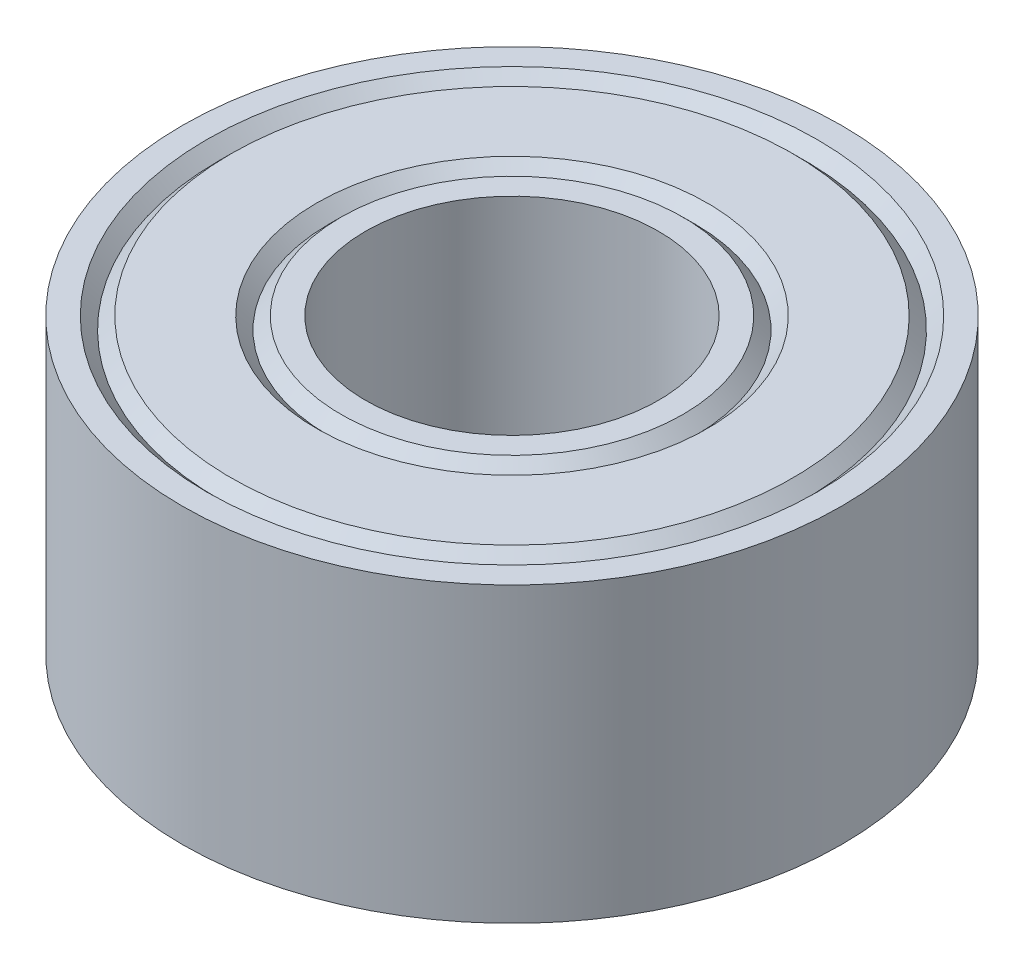
ISO-10303-21;
HEADER;
FILE_DESCRIPTION(('STEP AP214'),'2;1');
FILE_NAME('part.step','',(''),(''),'','','');
FILE_SCHEMA(('AUTOMOTIVE_DESIGN { 1 0 10303 214 1 1 1 1 }'));
ENDSEC;
DATA;
#1=APPLICATION_CONTEXT('core data for automotive mechanical design processes');
#2=APPLICATION_PROTOCOL_DEFINITION('international standard','automotive_design',2000,#1);
#3=PRODUCT_CONTEXT('',#1,'mechanical');
#4=PRODUCT('Part','Part','',(#3));
#5=PRODUCT_RELATED_PRODUCT_CATEGORY('part','',(#4));
#6=PRODUCT_DEFINITION_FORMATION('','',#4);
#7=PRODUCT_DEFINITION_CONTEXT('part definition',#1,'design');
#8=PRODUCT_DEFINITION('design','',#6,#7);
#9=PRODUCT_DEFINITION_SHAPE('','',#8);
#10=(LENGTH_UNIT() NAMED_UNIT(*) SI_UNIT(.MILLI.,.METRE.));
#11=(NAMED_UNIT(*) PLANE_ANGLE_UNIT() SI_UNIT($,.RADIAN.));
#12=(NAMED_UNIT(*) SI_UNIT($,.STERADIAN.) SOLID_ANGLE_UNIT());
#13=UNCERTAINTY_MEASURE_WITH_UNIT(LENGTH_MEASURE(1.E-05),#10,'distance_accuracy_value','');
#14=(GEOMETRIC_REPRESENTATION_CONTEXT(3) GLOBAL_UNCERTAINTY_ASSIGNED_CONTEXT((#13)) GLOBAL_UNIT_ASSIGNED_CONTEXT((#10,
#11,#12)) REPRESENTATION_CONTEXT('',''));
#15=CARTESIAN_POINT('',(0.,0.,0.));
#16=DIRECTION('',(0.,0.,1.));
#17=DIRECTION('',(1.,0.,0.));
#18=AXIS2_PLACEMENT_3D('',#15,#16,#17);
#19=CARTESIAN_POINT('',(0.,2.,0.));
#20=DIRECTION('',(0.,1.,0.));
#21=DIRECTION('',(-1.,0.,0.));
#22=AXIS2_PLACEMENT_3D('',#19,#20,#21);
#23=CYLINDRICAL_SURFACE('',#22,2.);
#24=CARTESIAN_POINT('',(0.,2.,0.));
#25=DIRECTION('',(0.,1.,0.));
#26=DIRECTION('',(-1.,0.,0.));
#27=AXIS2_PLACEMENT_3D('',#24,#25,#26);
#28=CIRCLE('',#27,1.99999999999999);
#29=CARTESIAN_POINT('',(-1.99999999999999,2.,0.));
#30=VERTEX_POINT('',#29);
#31=EDGE_CURVE('E83',#30,#30,#28,.T.);
#32=ORIENTED_EDGE('',*,*,#31,.T.);
#33=EDGE_LOOP('',(#32));
#34=FACE_BOUND('',#33,.T.);
#35=CARTESIAN_POINT('',(0.,-1.99999999999999,0.));
#36=DIRECTION('',(0.,1.,0.));
#37=DIRECTION('',(-1.,0.,0.));
#38=AXIS2_PLACEMENT_3D('',#35,#36,#37);
#39=CIRCLE('',#38,2.);
#40=CARTESIAN_POINT('',(-1.99999999999999,-2.,0.));
#41=VERTEX_POINT('',#40);
#42=EDGE_CURVE('E10',#41,#41,#39,.T.);
#43=ORIENTED_EDGE('',*,*,#42,.F.);
#44=EDGE_LOOP('',(#43));
#45=FACE_BOUND('',#44,.T.);
#46=ADVANCED_FACE('F31',(#34,#45),#23,.F.);
#47=CARTESIAN_POINT('',(-1.99999999999999,-2.,0.));
#48=DIRECTION('',(0.,-1.,0.));
#49=DIRECTION('',(1.,0.,0.));
#50=AXIS2_PLACEMENT_3D('',#47,#48,#49);
#51=PLANE('',#50);
#52=ORIENTED_EDGE('',*,*,#42,.T.);
#53=EDGE_LOOP('',(#52));
#54=FACE_BOUND('',#53,.T.);
#55=CARTESIAN_POINT('',(0.,-1.99999999999999,0.));
#56=DIRECTION('',(0.,1.,0.));
#57=DIRECTION('',(-1.,0.,0.));
#58=AXIS2_PLACEMENT_3D('',#55,#56,#57);
#59=CIRCLE('',#58,2.33333333333334);
#60=CARTESIAN_POINT('',(-2.33333333333333,-2.,0.));
#61=VERTEX_POINT('',#60);
#62=EDGE_CURVE('E37',#61,#61,#59,.T.);
#63=ORIENTED_EDGE('',*,*,#62,.F.);
#64=EDGE_LOOP('',(#63));
#65=FACE_BOUND('',#64,.T.);
#66=ADVANCED_FACE('F101',(#54,#65),#51,.T.);
#67=CARTESIAN_POINT('',(0.,-1.83333333333332,0.));
#68=DIRECTION('',(0.,1.,0.));
#69=DIRECTION('',(-1.,0.,0.));
#70=AXIS2_PLACEMENT_3D('',#67,#68,#69);
#71=CONICAL_SURFACE('',#70,2.50000000000002,0.785398163397486);
#72=ORIENTED_EDGE('',*,*,#62,.T.);
#73=EDGE_LOOP('',(#72));
#74=FACE_BOUND('',#73,.T.);
#75=CARTESIAN_POINT('',(0.,-1.83333333333332,0.));
#76=DIRECTION('',(0.,1.,0.));
#77=DIRECTION('',(-1.,0.,0.));
#78=AXIS2_PLACEMENT_3D('',#75,#76,#77);
#79=CIRCLE('',#78,2.50000000000002);
#80=CARTESIAN_POINT('',(-2.50000000000001,-1.83333333333333,0.));
#81=VERTEX_POINT('',#80);
#82=EDGE_CURVE('E41',#81,#81,#79,.T.);
#83=ORIENTED_EDGE('',*,*,#82,.F.);
#84=EDGE_LOOP('',(#83));
#85=FACE_BOUND('',#84,.T.);
#86=ADVANCED_FACE('F105',(#74,#85),#71,.T.);
#87=CARTESIAN_POINT('',(0.,-1.99999999999999,0.));
#88=DIRECTION('',(0.,-1.,0.));
#89=DIRECTION('',(1.,0.,0.));
#90=AXIS2_PLACEMENT_3D('',#87,#88,#89);
#91=CONICAL_SURFACE('',#90,2.66666666666669,0.785398163397433);
#92=ORIENTED_EDGE('',*,*,#82,.T.);
#93=EDGE_LOOP('',(#92));
#94=FACE_BOUND('',#93,.T.);
#95=CARTESIAN_POINT('',(0.,-1.99999999999999,0.));
#96=DIRECTION('',(0.,1.,0.));
#97=DIRECTION('',(-1.,0.,0.));
#98=AXIS2_PLACEMENT_3D('',#95,#96,#97);
#99=CIRCLE('',#98,2.66666666666669);
#100=CARTESIAN_POINT('',(-2.66666666666667,-2.,0.));
#101=VERTEX_POINT('',#100);
#102=EDGE_CURVE('E45',#101,#101,#99,.T.);
#103=ORIENTED_EDGE('',*,*,#102,.F.);
#104=EDGE_LOOP('',(#103));
#105=FACE_BOUND('',#104,.T.);
#106=ADVANCED_FACE('F109',(#94,#105),#91,.F.);
#107=CARTESIAN_POINT('',(-2.66666666666667,-2.,0.));
#108=DIRECTION('',(0.,-1.,0.));
#109=DIRECTION('',(1.,0.,0.));
#110=AXIS2_PLACEMENT_3D('',#107,#108,#109);
#111=PLANE('',#110);
#112=ORIENTED_EDGE('',*,*,#102,.T.);
#113=EDGE_LOOP('',(#112));
#114=FACE_BOUND('',#113,.T.);
#115=CARTESIAN_POINT('',(0.,-1.99999999999999,0.));
#116=DIRECTION('',(0.,1.,0.));
#117=DIRECTION('',(-1.,0.,0.));
#118=AXIS2_PLACEMENT_3D('',#115,#116,#117);
#119=CIRCLE('',#118,3.83333333333336);
#120=CARTESIAN_POINT('',(-3.83333333333335,-2.,0.));
#121=VERTEX_POINT('',#120);
#122=EDGE_CURVE('E50',#121,#121,#119,.T.);
#123=ORIENTED_EDGE('',*,*,#122,.F.);
#124=EDGE_LOOP('',(#123));
#125=FACE_BOUND('',#124,.T.);
#126=ADVANCED_FACE('F115',(#114,#125),#111,.T.);
#127=CARTESIAN_POINT('',(0.,-1.83333333333332,0.));
#128=DIRECTION('',(0.,1.,0.));
#129=DIRECTION('',(-1.,0.,0.));
#130=AXIS2_PLACEMENT_3D('',#127,#128,#129);
#131=CONICAL_SURFACE('',#130,4.00000000000002,0.785398163397429);
#132=ORIENTED_EDGE('',*,*,#122,.T.);
#133=EDGE_LOOP('',(#132));
#134=FACE_BOUND('',#133,.T.);
#135=CARTESIAN_POINT('',(0.,-1.83333333333332,0.));
#136=DIRECTION('',(0.,1.,0.));
#137=DIRECTION('',(-1.,0.,0.));
#138=AXIS2_PLACEMENT_3D('',#135,#136,#137);
#139=CIRCLE('',#138,4.00000000000002);
#140=CARTESIAN_POINT('',(-4.00000000000001,-1.83333333333333,0.));
#141=VERTEX_POINT('',#140);
#142=EDGE_CURVE('E53',#141,#141,#139,.T.);
#143=ORIENTED_EDGE('',*,*,#142,.F.);
#144=EDGE_LOOP('',(#143));
#145=FACE_BOUND('',#144,.T.);
#146=ADVANCED_FACE('F119',(#134,#145),#131,.T.);
#147=CARTESIAN_POINT('',(0.,-2.,0.));
#148=DIRECTION('',(0.,-1.,0.));
#149=DIRECTION('',(1.,0.,0.));
#150=AXIS2_PLACEMENT_3D('',#147,#148,#149);
#151=CONICAL_SURFACE('',#150,4.16666666666668,0.785398163397395);
#152=ORIENTED_EDGE('',*,*,#142,.T.);
#153=EDGE_LOOP('',(#152));
#154=FACE_BOUND('',#153,.T.);
#155=CARTESIAN_POINT('',(0.,-2.,0.));
#156=DIRECTION('',(0.,1.,0.));
#157=DIRECTION('',(-1.,0.,0.));
#158=AXIS2_PLACEMENT_3D('',#155,#156,#157);
#159=CIRCLE('',#158,4.16666666666668);
#160=CARTESIAN_POINT('',(-4.16666666666667,-2.00000000000001,0.));
#161=VERTEX_POINT('',#160);
#162=EDGE_CURVE('E56',#161,#161,#159,.T.);
#163=ORIENTED_EDGE('',*,*,#162,.F.);
#164=EDGE_LOOP('',(#163));
#165=FACE_BOUND('',#164,.T.);
#166=ADVANCED_FACE('F123',(#154,#165),#151,.F.);
#167=CARTESIAN_POINT('',(-4.16666666666667,-2.00000000000001,0.));
#168=DIRECTION('',(0.,-1.,0.));
#169=DIRECTION('',(1.,0.,0.));
#170=AXIS2_PLACEMENT_3D('',#167,#168,#169);
#171=PLANE('',#170);
#172=ORIENTED_EDGE('',*,*,#162,.T.);
#173=EDGE_LOOP('',(#172));
#174=FACE_BOUND('',#173,.T.);
#175=CARTESIAN_POINT('',(0.,-1.99999999999999,0.));
#176=DIRECTION('',(0.,1.,0.));
#177=DIRECTION('',(-1.,0.,0.));
#178=AXIS2_PLACEMENT_3D('',#175,#176,#177);
#179=CIRCLE('',#178,4.50000000000002);
#180=CARTESIAN_POINT('',(-4.50000000000001,-2.,0.));
#181=VERTEX_POINT('',#180);
#182=EDGE_CURVE('E59',#181,#181,#179,.T.);
#183=ORIENTED_EDGE('',*,*,#182,.F.);
#184=EDGE_LOOP('',(#183));
#185=FACE_BOUND('',#184,.T.);
#186=ADVANCED_FACE('F127',(#174,#185),#171,.T.);
#187=CARTESIAN_POINT('',(0.,2.,0.));
#188=DIRECTION('',(0.,1.,0.));
#189=DIRECTION('',(-1.,0.,0.));
#190=AXIS2_PLACEMENT_3D('',#187,#188,#189);
#191=CYLINDRICAL_SURFACE('',#190,4.50000000000001);
#192=ORIENTED_EDGE('',*,*,#182,.T.);
#193=EDGE_LOOP('',(#192));
#194=FACE_BOUND('',#193,.T.);
#195=CARTESIAN_POINT('',(0.,2.00000000000001,0.));
#196=DIRECTION('',(0.,1.,0.));
#197=DIRECTION('',(-1.,0.,0.));
#198=AXIS2_PLACEMENT_3D('',#195,#196,#197);
#199=CIRCLE('',#198,4.50000000000001);
#200=CARTESIAN_POINT('',(-4.50000000000001,2.,0.));
#201=VERTEX_POINT('',#200);
#202=EDGE_CURVE('E62',#201,#201,#199,.T.);
#203=ORIENTED_EDGE('',*,*,#202,.F.);
#204=EDGE_LOOP('',(#203));
#205=FACE_BOUND('',#204,.T.);
#206=ADVANCED_FACE('F131',(#194,#205),#191,.T.);
#207=CARTESIAN_POINT('',(-4.16666666666667,2.00000000000001,0.));
#208=DIRECTION('',(0.,1.,0.));
#209=DIRECTION('',(-1.,0.,0.));
#210=AXIS2_PLACEMENT_3D('',#207,#208,#209);
#211=PLANE('',#210);
#212=ORIENTED_EDGE('',*,*,#202,.T.);
#213=EDGE_LOOP('',(#212));
#214=FACE_BOUND('',#213,.T.);
#215=CARTESIAN_POINT('',(0.,2.00000000000002,0.));
#216=DIRECTION('',(0.,1.,0.));
#217=DIRECTION('',(-1.,0.,0.));
#218=AXIS2_PLACEMENT_3D('',#215,#216,#217);
#219=CIRCLE('',#218,4.16666666666667);
#220=CARTESIAN_POINT('',(-4.16666666666667,2.00000000000001,0.));
#221=VERTEX_POINT('',#220);
#222=EDGE_CURVE('E65',#221,#221,#219,.T.);
#223=ORIENTED_EDGE('',*,*,#222,.F.);
#224=EDGE_LOOP('',(#223));
#225=FACE_BOUND('',#224,.T.);
#226=ADVANCED_FACE('F135',(#214,#225),#211,.T.);
#227=CARTESIAN_POINT('',(0.,1.83333333333334,0.));
#228=DIRECTION('',(0.,1.,0.));
#229=DIRECTION('',(-1.,0.,0.));
#230=AXIS2_PLACEMENT_3D('',#227,#228,#229);
#231=CONICAL_SURFACE('',#230,4.00000000000001,0.785398163397384);
#232=ORIENTED_EDGE('',*,*,#222,.T.);
#233=EDGE_LOOP('',(#232));
#234=FACE_BOUND('',#233,.T.);
#235=CARTESIAN_POINT('',(0.,1.83333333333334,0.));
#236=DIRECTION('',(0.,1.,0.));
#237=DIRECTION('',(-1.,0.,0.));
#238=AXIS2_PLACEMENT_3D('',#235,#236,#237);
#239=CIRCLE('',#238,4.00000000000001);
#240=CARTESIAN_POINT('',(-4.00000000000001,1.83333333333333,0.));
#241=VERTEX_POINT('',#240);
#242=EDGE_CURVE('E68',#241,#241,#239,.T.);
#243=ORIENTED_EDGE('',*,*,#242,.F.);
#244=EDGE_LOOP('',(#243));
#245=FACE_BOUND('',#244,.T.);
#246=ADVANCED_FACE('F139',(#234,#245),#231,.F.);
#247=CARTESIAN_POINT('',(0.,2.00000000000001,0.));
#248=DIRECTION('',(0.,-1.,0.));
#249=DIRECTION('',(1.,0.,0.));
#250=AXIS2_PLACEMENT_3D('',#247,#248,#249);
#251=CONICAL_SURFACE('',#250,3.83333333333335,0.785398163397437);
#252=ORIENTED_EDGE('',*,*,#242,.T.);
#253=EDGE_LOOP('',(#252));
#254=FACE_BOUND('',#253,.T.);
#255=CARTESIAN_POINT('',(0.,2.00000000000001,0.));
#256=DIRECTION('',(0.,1.,0.));
#257=DIRECTION('',(-1.,0.,0.));
#258=AXIS2_PLACEMENT_3D('',#255,#256,#257);
#259=CIRCLE('',#258,3.83333333333335);
#260=CARTESIAN_POINT('',(-3.83333333333335,2.,0.));
#261=VERTEX_POINT('',#260);
#262=EDGE_CURVE('E71',#261,#261,#259,.T.);
#263=ORIENTED_EDGE('',*,*,#262,.F.);
#264=EDGE_LOOP('',(#263));
#265=FACE_BOUND('',#264,.T.);
#266=ADVANCED_FACE('F143',(#254,#265),#251,.T.);
#267=CARTESIAN_POINT('',(-2.66666666666667,2.,0.));
#268=DIRECTION('',(0.,1.,0.));
#269=DIRECTION('',(-1.,0.,0.));
#270=AXIS2_PLACEMENT_3D('',#267,#268,#269);
#271=PLANE('',#270);
#272=ORIENTED_EDGE('',*,*,#262,.T.);
#273=EDGE_LOOP('',(#272));
#274=FACE_BOUND('',#273,.T.);
#275=CARTESIAN_POINT('',(0.,2.00000000000001,0.));
#276=DIRECTION('',(0.,1.,0.));
#277=DIRECTION('',(-1.,0.,0.));
#278=AXIS2_PLACEMENT_3D('',#275,#276,#277);
#279=CIRCLE('',#278,2.66666666666667);
#280=CARTESIAN_POINT('',(-2.66666666666667,2.,0.));
#281=VERTEX_POINT('',#280);
#282=EDGE_CURVE('E74',#281,#281,#279,.T.);
#283=ORIENTED_EDGE('',*,*,#282,.F.);
#284=EDGE_LOOP('',(#283));
#285=FACE_BOUND('',#284,.T.);
#286=ADVANCED_FACE('F147',(#274,#285),#271,.T.);
#287=CARTESIAN_POINT('',(0.,1.83333333333334,0.));
#288=DIRECTION('',(0.,1.,0.));
#289=DIRECTION('',(-1.,0.,0.));
#290=AXIS2_PLACEMENT_3D('',#287,#288,#289);
#291=CONICAL_SURFACE('',#290,2.50000000000001,0.78539816339742);
#292=ORIENTED_EDGE('',*,*,#282,.T.);
#293=EDGE_LOOP('',(#292));
#294=FACE_BOUND('',#293,.T.);
#295=CARTESIAN_POINT('',(0.,1.83333333333334,0.));
#296=DIRECTION('',(0.,1.,0.));
#297=DIRECTION('',(-1.,0.,0.));
#298=AXIS2_PLACEMENT_3D('',#295,#296,#297);
#299=CIRCLE('',#298,2.50000000000001);
#300=CARTESIAN_POINT('',(-2.50000000000001,1.83333333333333,0.));
#301=VERTEX_POINT('',#300);
#302=EDGE_CURVE('E77',#301,#301,#299,.T.);
#303=ORIENTED_EDGE('',*,*,#302,.F.);
#304=EDGE_LOOP('',(#303));
#305=FACE_BOUND('',#304,.T.);
#306=ADVANCED_FACE('F97',(#294,#305),#291,.F.);
#307=CARTESIAN_POINT('',(0.,2.00000000000001,0.));
#308=DIRECTION('',(0.,-1.,0.));
#309=DIRECTION('',(1.,0.,0.));
#310=AXIS2_PLACEMENT_3D('',#307,#308,#309);
#311=CONICAL_SURFACE('',#310,2.33333333333333,0.785398163397484);
#312=ORIENTED_EDGE('',*,*,#302,.T.);
#313=EDGE_LOOP('',(#312));
#314=FACE_BOUND('',#313,.T.);
#315=CARTESIAN_POINT('',(0.,2.00000000000001,0.));
#316=DIRECTION('',(0.,1.,0.));
#317=DIRECTION('',(-1.,0.,0.));
#318=AXIS2_PLACEMENT_3D('',#315,#316,#317);
#319=CIRCLE('',#318,2.33333333333333);
#320=CARTESIAN_POINT('',(-2.33333333333333,2.,0.));
#321=VERTEX_POINT('',#320);
#322=EDGE_CURVE('E80',#321,#321,#319,.T.);
#323=ORIENTED_EDGE('',*,*,#322,.F.);
#324=EDGE_LOOP('',(#323));
#325=FACE_BOUND('',#324,.T.);
#326=ADVANCED_FACE('F91',(#314,#325),#311,.T.);
#327=CARTESIAN_POINT('',(-1.99999999999999,2.,0.));
#328=DIRECTION('',(0.,1.,0.));
#329=DIRECTION('',(-1.,0.,0.));
#330=AXIS2_PLACEMENT_3D('',#327,#328,#329);
#331=PLANE('',#330);
#332=ORIENTED_EDGE('',*,*,#322,.T.);
#333=EDGE_LOOP('',(#332));
#334=FACE_BOUND('',#333,.T.);
#335=ORIENTED_EDGE('',*,*,#31,.F.);
#336=EDGE_LOOP('',(#335));
#337=FACE_BOUND('',#336,.T.);
#338=ADVANCED_FACE('F89',(#334,#337),#331,.T.);
#339=CLOSED_SHELL('',(#46,#66,#86,#106,#126,#146,#166,#186,#206,#226,#246,#266,#286,#306,#326,#338));
#340=MANIFOLD_SOLID_BREP('B2',#339);
#341=ADVANCED_BREP_SHAPE_REPRESENTATION('',(#18,#340),#14);
#342=SHAPE_DEFINITION_REPRESENTATION(#9,#341);
ENDSEC;
END-ISO-10303-21;
